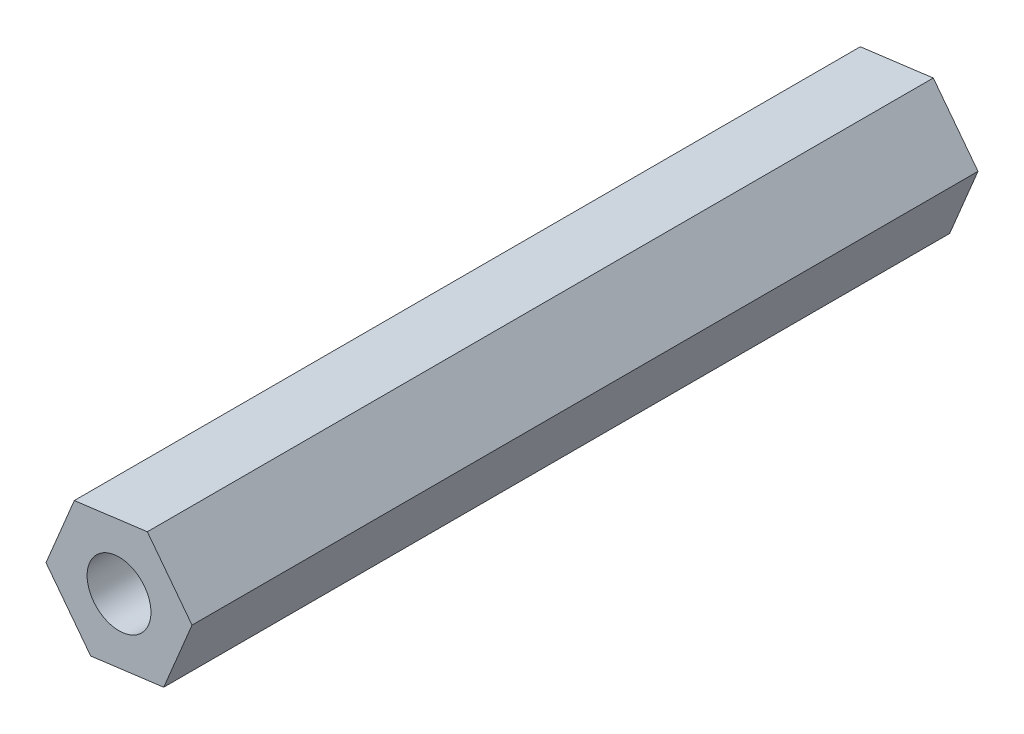
ISO-10303-21;
HEADER;
FILE_DESCRIPTION(('STEP AP214'),'2;1');
FILE_NAME('part.step','',(''),(''),'','','');
FILE_SCHEMA(('AUTOMOTIVE_DESIGN { 1 0 10303 214 1 1 1 1 }'));
ENDSEC;
DATA;
#1=APPLICATION_CONTEXT('core data for automotive mechanical design processes');
#2=APPLICATION_PROTOCOL_DEFINITION('international standard','automotive_design',2000,#1);
#3=PRODUCT_CONTEXT('',#1,'mechanical');
#4=PRODUCT('Part','Part','',(#3));
#5=PRODUCT_RELATED_PRODUCT_CATEGORY('part','',(#4));
#6=PRODUCT_DEFINITION_FORMATION('','',#4);
#7=PRODUCT_DEFINITION_CONTEXT('part definition',#1,'design');
#8=PRODUCT_DEFINITION('design','',#6,#7);
#9=PRODUCT_DEFINITION_SHAPE('','',#8);
#10=(LENGTH_UNIT() NAMED_UNIT(*) SI_UNIT(.MILLI.,.METRE.));
#11=(NAMED_UNIT(*) PLANE_ANGLE_UNIT() SI_UNIT($,.RADIAN.));
#12=(NAMED_UNIT(*) SI_UNIT($,.STERADIAN.) SOLID_ANGLE_UNIT());
#13=UNCERTAINTY_MEASURE_WITH_UNIT(LENGTH_MEASURE(1.E-05),#10,'distance_accuracy_value','');
#14=(GEOMETRIC_REPRESENTATION_CONTEXT(3) GLOBAL_UNCERTAINTY_ASSIGNED_CONTEXT((#13)) GLOBAL_UNIT_ASSIGNED_CONTEXT((#10,
#11,#12)) REPRESENTATION_CONTEXT('',''));
#15=CARTESIAN_POINT('',(0.,0.,0.));
#16=DIRECTION('',(0.,0.,1.));
#17=DIRECTION('',(1.,0.,0.));
#18=AXIS2_PLACEMENT_3D('',#15,#16,#17);
#19=CARTESIAN_POINT('',(0.,0.,78.27));
#20=DIRECTION('',(0.,0.,1.));
#21=DIRECTION('',(1.,0.,0.));
#22=AXIS2_PLACEMENT_3D('',#19,#20,#21);
#23=PLANE('',#22);
#24=DIRECTION('',(0.384520198768807,0.923116578086862,0.));
#25=VECTOR('',#24,1.);
#26=CARTESIAN_POINT('',(4.45207223514963,-5.8260094529912,78.27));
#27=LINE('',#26,#25);
#28=CARTESIAN_POINT('',(4.45207223514963,-5.8260094529912,78.27));
#29=VERTEX_POINT('',#28);
#30=CARTESIAN_POINT('',(7.27150830655346,0.942602928627349,78.27));
#31=VERTEX_POINT('',#30);
#32=EDGE_CURVE('E128',#29,#31,#27,.T.);
#33=ORIENTED_EDGE('',*,*,#32,.T.);
#34=DIRECTION('',(-0.607182307893379,0.79456254944546,0.));
#35=VECTOR('',#34,1.);
#36=CARTESIAN_POINT('',(7.27150830655346,0.942602928627349,78.27));
#37=LINE('',#36,#35);
#38=CARTESIAN_POINT('',(2.81943607140384,6.76861238161854,78.27));
#39=VERTEX_POINT('',#38);
#40=EDGE_CURVE('E86',#31,#39,#37,.T.);
#41=ORIENTED_EDGE('',*,*,#40,.T.);
#42=DIRECTION('',(-0.991702506662188,-0.1285540286414,0.));
#43=VECTOR('',#42,1.);
#44=CARTESIAN_POINT('',(2.81943607140384,6.76861238161854,78.27));
#45=LINE('',#44,#43);
#46=CARTESIAN_POINT('',(-4.45207223514962,5.8260094529912,78.27));
#47=VERTEX_POINT('',#46);
#48=EDGE_CURVE('E99',#39,#47,#45,.T.);
#49=ORIENTED_EDGE('',*,*,#48,.T.);
#50=DIRECTION('',(-0.384520198768808,-0.923116578086861,0.));
#51=VECTOR('',#50,1.);
#52=CARTESIAN_POINT('',(-4.45207223514962,5.8260094529912,78.27));
#53=LINE('',#52,#51);
#54=CARTESIAN_POINT('',(-7.27150830655346,-0.942602928627337,78.27));
#55=VERTEX_POINT('',#54);
#56=EDGE_CURVE('E93',#47,#55,#53,.T.);
#57=ORIENTED_EDGE('',*,*,#56,.T.);
#58=DIRECTION('',(0.607182307893379,-0.79456254944546,0.));
#59=VECTOR('',#58,1.);
#60=CARTESIAN_POINT('',(-7.27150830655346,-0.942602928627337,78.27));
#61=LINE('',#60,#59);
#62=CARTESIAN_POINT('',(-2.81943607140382,-6.76861238161854,78.27));
#63=VERTEX_POINT('',#62);
#64=EDGE_CURVE('E97',#55,#63,#61,.T.);
#65=ORIENTED_EDGE('',*,*,#64,.T.);
#66=DIRECTION('',(0.991702506662188,0.1285540286414,0.));
#67=VECTOR('',#66,1.);
#68=CARTESIAN_POINT('',(-2.81943607140382,-6.76861238161854,78.27));
#69=LINE('',#68,#67);
#70=EDGE_CURVE('E49',#63,#29,#69,.T.);
#71=ORIENTED_EDGE('',*,*,#70,.T.);
#72=EDGE_LOOP('',(#33,#41,#49,#57,#65,#71));
#73=FACE_BOUND('',#72,.T.);
#74=CARTESIAN_POINT('',(0.,0.,78.27));
#75=DIRECTION('',(0.,0.,1.));
#76=DIRECTION('',(1.,0.,0.));
#77=AXIS2_PLACEMENT_3D('',#74,#75,#76);
#78=CIRCLE('',#77,3.18);
#79=CARTESIAN_POINT('',(3.18,0.,78.27));
#80=VERTEX_POINT('',#79);
#81=EDGE_CURVE('E121',#80,#80,#78,.T.);
#82=ORIENTED_EDGE('',*,*,#81,.F.);
#83=EDGE_LOOP('',(#82));
#84=FACE_BOUND('',#83,.T.);
#85=ADVANCED_FACE('F32',(#73,#84),#23,.T.);
#86=CARTESIAN_POINT('',(0.,0.,0.));
#87=DIRECTION('',(0.,0.,1.));
#88=DIRECTION('',(1.,0.,0.));
#89=AXIS2_PLACEMENT_3D('',#86,#87,#88);
#90=PLANE('',#89);
#91=DIRECTION('',(0.384520198768807,0.923116578086862,0.));
#92=VECTOR('',#91,1.);
#93=CARTESIAN_POINT('',(4.45207223514963,-5.8260094529912,0.));
#94=LINE('',#93,#92);
#95=CARTESIAN_POINT('',(4.45207223514963,-5.8260094529912,0.));
#96=VERTEX_POINT('',#95);
#97=CARTESIAN_POINT('',(7.27150830655346,0.942602928627349,0.));
#98=VERTEX_POINT('',#97);
#99=EDGE_CURVE('E117',#96,#98,#94,.T.);
#100=ORIENTED_EDGE('',*,*,#99,.F.);
#101=DIRECTION('',(0.991702506662188,0.1285540286414,0.));
#102=VECTOR('',#101,1.);
#103=CARTESIAN_POINT('',(-2.81943607140382,-6.76861238161854,0.));
#104=LINE('',#103,#102);
#105=CARTESIAN_POINT('',(-2.81943607140382,-6.76861238161854,0.));
#106=VERTEX_POINT('',#105);
#107=EDGE_CURVE('E78',#106,#96,#104,.T.);
#108=ORIENTED_EDGE('',*,*,#107,.F.);
#109=DIRECTION('',(0.607182307893379,-0.79456254944546,0.));
#110=VECTOR('',#109,1.);
#111=CARTESIAN_POINT('',(-7.27150830655346,-0.942602928627337,0.));
#112=LINE('',#111,#110);
#113=CARTESIAN_POINT('',(-7.27150830655346,-0.942602928627337,0.));
#114=VERTEX_POINT('',#113);
#115=EDGE_CURVE('E72',#114,#106,#112,.T.);
#116=ORIENTED_EDGE('',*,*,#115,.F.);
#117=DIRECTION('',(-0.384520198768808,-0.923116578086861,0.));
#118=VECTOR('',#117,1.);
#119=CARTESIAN_POINT('',(-4.45207223514962,5.8260094529912,0.));
#120=LINE('',#119,#118);
#121=CARTESIAN_POINT('',(-4.45207223514962,5.8260094529912,0.));
#122=VERTEX_POINT('',#121);
#123=EDGE_CURVE('E107',#122,#114,#120,.T.);
#124=ORIENTED_EDGE('',*,*,#123,.F.);
#125=DIRECTION('',(-0.991702506662188,-0.1285540286414,0.));
#126=VECTOR('',#125,1.);
#127=CARTESIAN_POINT('',(2.81943607140384,6.76861238161854,0.));
#128=LINE('',#127,#126);
#129=CARTESIAN_POINT('',(2.81943607140384,6.76861238161854,0.));
#130=VERTEX_POINT('',#129);
#131=EDGE_CURVE('E123',#130,#122,#128,.T.);
#132=ORIENTED_EDGE('',*,*,#131,.F.);
#133=DIRECTION('',(-0.607182307893379,0.79456254944546,0.));
#134=VECTOR('',#133,1.);
#135=CARTESIAN_POINT('',(7.27150830655346,0.942602928627349,0.));
#136=LINE('',#135,#134);
#137=EDGE_CURVE('E120',#98,#130,#136,.T.);
#138=ORIENTED_EDGE('',*,*,#137,.F.);
#139=EDGE_LOOP('',(#100,#108,#116,#124,#132,#138));
#140=FACE_BOUND('',#139,.T.);
#141=CARTESIAN_POINT('',(0.,0.,0.));
#142=DIRECTION('',(0.,0.,1.));
#143=DIRECTION('',(1.,0.,0.));
#144=AXIS2_PLACEMENT_3D('',#141,#142,#143);
#145=CIRCLE('',#144,3.18);
#146=CARTESIAN_POINT('',(3.18,0.,0.));
#147=VERTEX_POINT('',#146);
#148=EDGE_CURVE('E221',#147,#147,#145,.T.);
#149=ORIENTED_EDGE('',*,*,#148,.T.);
#150=EDGE_LOOP('',(#149));
#151=FACE_BOUND('',#150,.T.);
#152=ADVANCED_FACE('F137',(#140,#151),#90,.F.);
#153=CARTESIAN_POINT('',(4.45207223514963,-5.8260094529912,78.27));
#154=DIRECTION('',(-0.923116578086862,0.384520198768807,0.));
#155=DIRECTION('',(-0.384520198768807,-0.923116578086862,0.));
#156=AXIS2_PLACEMENT_3D('',#153,#154,#155);
#157=PLANE('',#156);
#158=ORIENTED_EDGE('',*,*,#99,.T.);
#159=DIRECTION('',(0.,0.,-1.));
#160=VECTOR('',#159,1.);
#161=CARTESIAN_POINT('',(7.27150830655346,0.942602928627349,78.27));
#162=LINE('',#161,#160);
#163=EDGE_CURVE('E11',#31,#98,#162,.T.);
#164=ORIENTED_EDGE('',*,*,#163,.F.);
#165=ORIENTED_EDGE('',*,*,#32,.F.);
#166=DIRECTION('',(0.,0.,-1.));
#167=VECTOR('',#166,1.);
#168=CARTESIAN_POINT('',(4.45207223514963,-5.8260094529912,78.27));
#169=LINE('',#168,#167);
#170=EDGE_CURVE('E113',#29,#96,#169,.T.);
#171=ORIENTED_EDGE('',*,*,#170,.T.);
#172=EDGE_LOOP('',(#158,#164,#165,#171));
#173=FACE_BOUND('',#172,.T.);
#174=ADVANCED_FACE('F34',(#173),#157,.F.);
#175=CARTESIAN_POINT('',(7.27150830655346,0.942602928627349,78.27));
#176=DIRECTION('',(-0.79456254944546,-0.607182307893379,0.));
#177=DIRECTION('',(0.607182307893379,-0.79456254944546,0.));
#178=AXIS2_PLACEMENT_3D('',#175,#176,#177);
#179=PLANE('',#178);
#180=ORIENTED_EDGE('',*,*,#137,.T.);
#181=DIRECTION('',(0.,0.,-1.));
#182=VECTOR('',#181,1.);
#183=CARTESIAN_POINT('',(2.81943607140384,6.76861238161854,78.27));
#184=LINE('',#183,#182);
#185=EDGE_CURVE('E41',#39,#130,#184,.T.);
#186=ORIENTED_EDGE('',*,*,#185,.F.);
#187=ORIENTED_EDGE('',*,*,#40,.F.);
#188=ORIENTED_EDGE('',*,*,#163,.T.);
#189=EDGE_LOOP('',(#180,#186,#187,#188));
#190=FACE_BOUND('',#189,.T.);
#191=ADVANCED_FACE('F162',(#190),#179,.F.);
#192=CARTESIAN_POINT('',(2.81943607140384,6.76861238161854,78.27));
#193=DIRECTION('',(0.1285540286414,-0.991702506662188,0.));
#194=DIRECTION('',(0.991702506662188,0.1285540286414,0.));
#195=AXIS2_PLACEMENT_3D('',#192,#193,#194);
#196=PLANE('',#195);
#197=ORIENTED_EDGE('',*,*,#131,.T.);
#198=DIRECTION('',(0.,0.,-1.));
#199=VECTOR('',#198,1.);
#200=CARTESIAN_POINT('',(-4.45207223514962,5.8260094529912,78.27));
#201=LINE('',#200,#199);
#202=EDGE_CURVE('E108',#47,#122,#201,.T.);
#203=ORIENTED_EDGE('',*,*,#202,.F.);
#204=ORIENTED_EDGE('',*,*,#48,.F.);
#205=ORIENTED_EDGE('',*,*,#185,.T.);
#206=EDGE_LOOP('',(#197,#203,#204,#205));
#207=FACE_BOUND('',#206,.T.);
#208=ADVANCED_FACE('F134',(#207),#196,.F.);
#209=CARTESIAN_POINT('',(-4.45207223514962,5.8260094529912,78.27));
#210=DIRECTION('',(0.923116578086861,-0.384520198768808,0.));
#211=DIRECTION('',(0.384520198768808,0.923116578086861,0.));
#212=AXIS2_PLACEMENT_3D('',#209,#210,#211);
#213=PLANE('',#212);
#214=ORIENTED_EDGE('',*,*,#123,.T.);
#215=DIRECTION('',(0.,0.,-1.));
#216=VECTOR('',#215,1.);
#217=CARTESIAN_POINT('',(-7.27150830655346,-0.942602928627337,78.27));
#218=LINE('',#217,#216);
#219=EDGE_CURVE('E104',#55,#114,#218,.T.);
#220=ORIENTED_EDGE('',*,*,#219,.F.);
#221=ORIENTED_EDGE('',*,*,#56,.F.);
#222=ORIENTED_EDGE('',*,*,#202,.T.);
#223=EDGE_LOOP('',(#214,#220,#221,#222));
#224=FACE_BOUND('',#223,.T.);
#225=ADVANCED_FACE('F105',(#224),#213,.F.);
#226=CARTESIAN_POINT('',(-7.27150830655346,-0.942602928627337,78.27));
#227=DIRECTION('',(0.794562549445461,0.607182307893379,0.));
#228=DIRECTION('',(-0.607182307893379,0.794562549445461,0.));
#229=AXIS2_PLACEMENT_3D('',#226,#227,#228);
#230=PLANE('',#229);
#231=ORIENTED_EDGE('',*,*,#115,.T.);
#232=DIRECTION('',(0.,0.,-1.));
#233=VECTOR('',#232,1.);
#234=CARTESIAN_POINT('',(-2.81943607140382,-6.76861238161854,78.27));
#235=LINE('',#234,#233);
#236=EDGE_CURVE('E109',#63,#106,#235,.T.);
#237=ORIENTED_EDGE('',*,*,#236,.F.);
#238=ORIENTED_EDGE('',*,*,#64,.F.);
#239=ORIENTED_EDGE('',*,*,#219,.T.);
#240=EDGE_LOOP('',(#231,#237,#238,#239));
#241=FACE_BOUND('',#240,.T.);
#242=ADVANCED_FACE('F111',(#241),#230,.F.);
#243=CARTESIAN_POINT('',(-2.81943607140382,-6.76861238161854,78.27));
#244=DIRECTION('',(-0.1285540286414,0.991702506662188,0.));
#245=DIRECTION('',(-0.991702506662188,-0.1285540286414,0.));
#246=AXIS2_PLACEMENT_3D('',#243,#244,#245);
#247=PLANE('',#246);
#248=ORIENTED_EDGE('',*,*,#107,.T.);
#249=ORIENTED_EDGE('',*,*,#170,.F.);
#250=ORIENTED_EDGE('',*,*,#70,.F.);
#251=ORIENTED_EDGE('',*,*,#236,.T.);
#252=EDGE_LOOP('',(#248,#249,#250,#251));
#253=FACE_BOUND('',#252,.T.);
#254=ADVANCED_FACE('F142',(#253),#247,.F.);
#255=CARTESIAN_POINT('',(0.,0.,78.27));
#256=DIRECTION('',(0.,0.,-1.));
#257=DIRECTION('',(-1.,0.,0.));
#258=AXIS2_PLACEMENT_3D('',#255,#256,#257);
#259=CYLINDRICAL_SURFACE('',#258,3.18);
#260=ORIENTED_EDGE('',*,*,#81,.T.);
#261=EDGE_LOOP('',(#260));
#262=FACE_BOUND('',#261,.T.);
#263=ORIENTED_EDGE('',*,*,#148,.F.);
#264=EDGE_LOOP('',(#263));
#265=FACE_BOUND('',#264,.T.);
#266=ADVANCED_FACE('F144',(#262,#265),#259,.F.);
#267=CLOSED_SHELL('',(#85,#152,#174,#191,#208,#225,#242,#254,#266));
#268=MANIFOLD_SOLID_BREP('B2',#267);
#269=ADVANCED_BREP_SHAPE_REPRESENTATION('',(#18,#268),#14);
#270=SHAPE_DEFINITION_REPRESENTATION(#9,#269);
ENDSEC;
END-ISO-10303-21;
